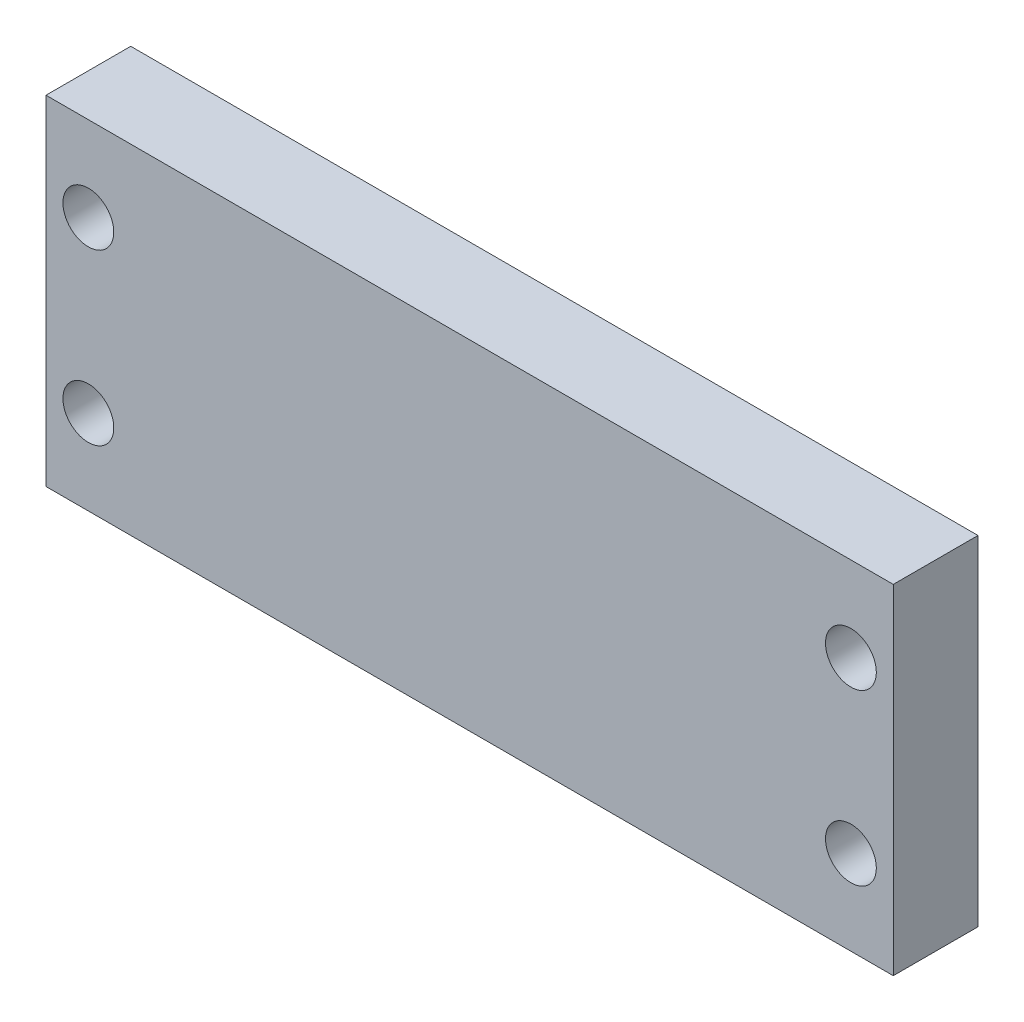
ISO-10303-21;
HEADER;
FILE_DESCRIPTION(('STEP AP214'),'2;1');
FILE_NAME('part.step','',(''),(''),'','','');
FILE_SCHEMA(('AUTOMOTIVE_DESIGN { 1 0 10303 214 1 1 1 1 }'));
ENDSEC;
DATA;
#1=APPLICATION_CONTEXT('core data for automotive mechanical design processes');
#2=APPLICATION_PROTOCOL_DEFINITION('international standard','automotive_design',2000,#1);
#3=PRODUCT_CONTEXT('',#1,'mechanical');
#4=PRODUCT('Part','Part','',(#3));
#5=PRODUCT_RELATED_PRODUCT_CATEGORY('part','',(#4));
#6=PRODUCT_DEFINITION_FORMATION('','',#4);
#7=PRODUCT_DEFINITION_CONTEXT('part definition',#1,'design');
#8=PRODUCT_DEFINITION('design','',#6,#7);
#9=PRODUCT_DEFINITION_SHAPE('','',#8);
#10=(LENGTH_UNIT() NAMED_UNIT(*) SI_UNIT(.MILLI.,.METRE.));
#11=(NAMED_UNIT(*) PLANE_ANGLE_UNIT() SI_UNIT($,.RADIAN.));
#12=(NAMED_UNIT(*) SI_UNIT($,.STERADIAN.) SOLID_ANGLE_UNIT());
#13=UNCERTAINTY_MEASURE_WITH_UNIT(LENGTH_MEASURE(1.E-05),#10,'distance_accuracy_value','');
#14=(GEOMETRIC_REPRESENTATION_CONTEXT(3) GLOBAL_UNCERTAINTY_ASSIGNED_CONTEXT((#13)) GLOBAL_UNIT_ASSIGNED_CONTEXT((#10,
#11,#12)) REPRESENTATION_CONTEXT('',''));
#15=CARTESIAN_POINT('',(0.,0.,0.));
#16=DIRECTION('',(0.,0.,1.));
#17=DIRECTION('',(1.,0.,0.));
#18=AXIS2_PLACEMENT_3D('',#15,#16,#17);
#19=CARTESIAN_POINT('',(0.,0.,5.));
#20=DIRECTION('',(0.,0.,-1.));
#21=DIRECTION('',(-1.,0.,0.));
#22=AXIS2_PLACEMENT_3D('',#19,#20,#21);
#23=PLANE('',#22);
#24=CARTESIAN_POINT('',(22.5,5.,5.));
#25=DIRECTION('',(0.,0.,1.));
#26=DIRECTION('',(1.,0.,0.));
#27=AXIS2_PLACEMENT_3D('',#24,#25,#26);
#28=CIRCLE('',#27,1.5);
#29=CARTESIAN_POINT('',(24.,5.,5.));
#30=VERTEX_POINT('',#29);
#31=EDGE_CURVE('E82',#30,#30,#28,.T.);
#32=ORIENTED_EDGE('',*,*,#31,.F.);
#33=EDGE_LOOP('',(#32));
#34=FACE_BOUND('',#33,.T.);
#35=DIRECTION('',(-1.,0.,0.));
#36=VECTOR('',#35,1.);
#37=CARTESIAN_POINT('',(0.,20.,5.));
#38=LINE('',#37,#36);
#39=CARTESIAN_POINT('',(25.,20.,5.));
#40=VERTEX_POINT('',#39);
#41=CARTESIAN_POINT('',(-25.,20.,5.));
#42=VERTEX_POINT('',#41);
#43=EDGE_CURVE('E117',#40,#42,#38,.T.);
#44=ORIENTED_EDGE('',*,*,#43,.T.);
#45=DIRECTION('',(0.,1.,0.));
#46=VECTOR('',#45,1.);
#47=CARTESIAN_POINT('',(-25.,0.,5.));
#48=LINE('',#47,#46);
#49=CARTESIAN_POINT('',(-25.,0.,5.));
#50=VERTEX_POINT('',#49);
#51=EDGE_CURVE('E89',#50,#42,#48,.T.);
#52=ORIENTED_EDGE('',*,*,#51,.F.);
#53=DIRECTION('',(1.,0.,0.));
#54=VECTOR('',#53,1.);
#55=CARTESIAN_POINT('',(0.,0.,5.));
#56=LINE('',#55,#54);
#57=CARTESIAN_POINT('',(25.,0.,5.));
#58=VERTEX_POINT('',#57);
#59=EDGE_CURVE('E66',#50,#58,#56,.T.);
#60=ORIENTED_EDGE('',*,*,#59,.T.);
#61=DIRECTION('',(0.,1.,0.));
#62=VECTOR('',#61,1.);
#63=CARTESIAN_POINT('',(25.,0.,5.));
#64=LINE('',#63,#62);
#65=EDGE_CURVE('E50',#58,#40,#64,.T.);
#66=ORIENTED_EDGE('',*,*,#65,.T.);
#67=EDGE_LOOP('',(#44,#52,#60,#66));
#68=FACE_BOUND('',#67,.T.);
#69=CARTESIAN_POINT('',(22.5,15.,5.));
#70=DIRECTION('',(0.,0.,1.));
#71=DIRECTION('',(1.,0.,0.));
#72=AXIS2_PLACEMENT_3D('',#69,#70,#71);
#73=CIRCLE('',#72,1.5);
#74=CARTESIAN_POINT('',(24.,15.,5.));
#75=VERTEX_POINT('',#74);
#76=EDGE_CURVE('E104',#75,#75,#73,.T.);
#77=ORIENTED_EDGE('',*,*,#76,.F.);
#78=EDGE_LOOP('',(#77));
#79=FACE_BOUND('',#78,.T.);
#80=CARTESIAN_POINT('',(-22.5,15.,5.));
#81=DIRECTION('',(0.,0.,-1.));
#82=DIRECTION('',(-1.,0.,0.));
#83=AXIS2_PLACEMENT_3D('',#80,#81,#82);
#84=CIRCLE('',#83,1.5);
#85=CARTESIAN_POINT('',(-24.,15.,5.));
#86=VERTEX_POINT('',#85);
#87=EDGE_CURVE('E164',#86,#86,#84,.T.);
#88=ORIENTED_EDGE('',*,*,#87,.T.);
#89=EDGE_LOOP('',(#88));
#90=FACE_BOUND('',#89,.T.);
#91=CARTESIAN_POINT('',(-22.5,5.,5.));
#92=DIRECTION('',(0.,0.,-1.));
#93=DIRECTION('',(-1.,0.,0.));
#94=AXIS2_PLACEMENT_3D('',#91,#92,#93);
#95=CIRCLE('',#94,1.5);
#96=CARTESIAN_POINT('',(-24.,5.,5.));
#97=VERTEX_POINT('',#96);
#98=EDGE_CURVE('E94',#97,#97,#95,.T.);
#99=ORIENTED_EDGE('',*,*,#98,.T.);
#100=EDGE_LOOP('',(#99));
#101=FACE_BOUND('',#100,.T.);
#102=ADVANCED_FACE('F33',(#34,#68,#79,#90,#101),#23,.F.);
#103=CARTESIAN_POINT('',(0.,0.,0.));
#104=DIRECTION('',(0.,0.,-1.));
#105=DIRECTION('',(-1.,0.,0.));
#106=AXIS2_PLACEMENT_3D('',#103,#104,#105);
#107=PLANE('',#106);
#108=CARTESIAN_POINT('',(22.5,5.,0.));
#109=DIRECTION('',(0.,0.,1.));
#110=DIRECTION('',(1.,0.,0.));
#111=AXIS2_PLACEMENT_3D('',#108,#109,#110);
#112=CIRCLE('',#111,1.5);
#113=CARTESIAN_POINT('',(24.,5.,0.));
#114=VERTEX_POINT('',#113);
#115=EDGE_CURVE('E107',#114,#114,#112,.T.);
#116=ORIENTED_EDGE('',*,*,#115,.T.);
#117=EDGE_LOOP('',(#116));
#118=FACE_BOUND('',#117,.T.);
#119=DIRECTION('',(1.,0.,0.));
#120=VECTOR('',#119,1.);
#121=CARTESIAN_POINT('',(0.,0.,0.));
#122=LINE('',#121,#120);
#123=CARTESIAN_POINT('',(-25.,0.,0.));
#124=VERTEX_POINT('',#123);
#125=CARTESIAN_POINT('',(25.,0.,0.));
#126=VERTEX_POINT('',#125);
#127=EDGE_CURVE('E61',#124,#126,#122,.T.);
#128=ORIENTED_EDGE('',*,*,#127,.F.);
#129=DIRECTION('',(0.,1.,0.));
#130=VECTOR('',#129,1.);
#131=CARTESIAN_POINT('',(-25.,0.,0.));
#132=LINE('',#131,#130);
#133=CARTESIAN_POINT('',(-25.,20.,0.));
#134=VERTEX_POINT('',#133);
#135=EDGE_CURVE('E80',#124,#134,#132,.T.);
#136=ORIENTED_EDGE('',*,*,#135,.T.);
#137=DIRECTION('',(-1.,0.,0.));
#138=VECTOR('',#137,1.);
#139=CARTESIAN_POINT('',(0.,20.,0.));
#140=LINE('',#139,#138);
#141=CARTESIAN_POINT('',(25.,20.,0.));
#142=VERTEX_POINT('',#141);
#143=EDGE_CURVE('E115',#142,#134,#140,.T.);
#144=ORIENTED_EDGE('',*,*,#143,.F.);
#145=DIRECTION('',(0.,1.,0.));
#146=VECTOR('',#145,1.);
#147=CARTESIAN_POINT('',(25.,0.,0.));
#148=LINE('',#147,#146);
#149=EDGE_CURVE('E81',#126,#142,#148,.T.);
#150=ORIENTED_EDGE('',*,*,#149,.F.);
#151=EDGE_LOOP('',(#128,#136,#144,#150));
#152=FACE_BOUND('',#151,.T.);
#153=CARTESIAN_POINT('',(22.5,15.,0.));
#154=DIRECTION('',(0.,0.,1.));
#155=DIRECTION('',(1.,0.,0.));
#156=AXIS2_PLACEMENT_3D('',#153,#154,#155);
#157=CIRCLE('',#156,1.5);
#158=CARTESIAN_POINT('',(24.,15.,0.));
#159=VERTEX_POINT('',#158);
#160=EDGE_CURVE('E103',#159,#159,#157,.T.);
#161=ORIENTED_EDGE('',*,*,#160,.T.);
#162=EDGE_LOOP('',(#161));
#163=FACE_BOUND('',#162,.T.);
#164=CARTESIAN_POINT('',(-22.5,15.,0.));
#165=DIRECTION('',(0.,0.,-1.));
#166=DIRECTION('',(-1.,0.,0.));
#167=AXIS2_PLACEMENT_3D('',#164,#165,#166);
#168=CIRCLE('',#167,1.5);
#169=CARTESIAN_POINT('',(-24.,15.,0.));
#170=VERTEX_POINT('',#169);
#171=EDGE_CURVE('E167',#170,#170,#168,.T.);
#172=ORIENTED_EDGE('',*,*,#171,.F.);
#173=EDGE_LOOP('',(#172));
#174=FACE_BOUND('',#173,.T.);
#175=CARTESIAN_POINT('',(-22.5,5.,0.));
#176=DIRECTION('',(0.,0.,-1.));
#177=DIRECTION('',(-1.,0.,0.));
#178=AXIS2_PLACEMENT_3D('',#175,#176,#177);
#179=CIRCLE('',#178,1.5);
#180=CARTESIAN_POINT('',(-24.,5.,0.));
#181=VERTEX_POINT('',#180);
#182=EDGE_CURVE('E98',#181,#181,#179,.T.);
#183=ORIENTED_EDGE('',*,*,#182,.F.);
#184=EDGE_LOOP('',(#183));
#185=FACE_BOUND('',#184,.T.);
#186=ADVANCED_FACE('F76',(#118,#152,#163,#174,#185),#107,.T.);
#187=CARTESIAN_POINT('',(0.,0.,5.));
#188=DIRECTION('',(0.,1.,0.));
#189=DIRECTION('',(0.,0.,1.));
#190=AXIS2_PLACEMENT_3D('',#187,#188,#189);
#191=PLANE('',#190);
#192=ORIENTED_EDGE('',*,*,#127,.T.);
#193=DIRECTION('',(0.,0.,-1.));
#194=VECTOR('',#193,1.);
#195=CARTESIAN_POINT('',(25.,0.,5.));
#196=LINE('',#195,#194);
#197=EDGE_CURVE('E11',#58,#126,#196,.T.);
#198=ORIENTED_EDGE('',*,*,#197,.F.);
#199=ORIENTED_EDGE('',*,*,#59,.F.);
#200=DIRECTION('',(0.,0.,-1.));
#201=VECTOR('',#200,1.);
#202=CARTESIAN_POINT('',(-25.,0.,5.));
#203=LINE('',#202,#201);
#204=EDGE_CURVE('E84',#50,#124,#203,.T.);
#205=ORIENTED_EDGE('',*,*,#204,.T.);
#206=EDGE_LOOP('',(#192,#198,#199,#205));
#207=FACE_BOUND('',#206,.T.);
#208=ADVANCED_FACE('F35',(#207),#191,.F.);
#209=CARTESIAN_POINT('',(25.,0.,5.));
#210=DIRECTION('',(-1.,0.,0.));
#211=DIRECTION('',(0.,0.,1.));
#212=AXIS2_PLACEMENT_3D('',#209,#210,#211);
#213=PLANE('',#212);
#214=ORIENTED_EDGE('',*,*,#149,.T.);
#215=DIRECTION('',(0.,0.,-1.));
#216=VECTOR('',#215,1.);
#217=CARTESIAN_POINT('',(25.,20.,5.));
#218=LINE('',#217,#216);
#219=EDGE_CURVE('E42',#40,#142,#218,.T.);
#220=ORIENTED_EDGE('',*,*,#219,.F.);
#221=ORIENTED_EDGE('',*,*,#65,.F.);
#222=ORIENTED_EDGE('',*,*,#197,.T.);
#223=EDGE_LOOP('',(#214,#220,#221,#222));
#224=FACE_BOUND('',#223,.T.);
#225=ADVANCED_FACE('F125',(#224),#213,.F.);
#226=CARTESIAN_POINT('',(0.,20.,5.));
#227=DIRECTION('',(0.,-1.,0.));
#228=DIRECTION('',(0.,0.,-1.));
#229=AXIS2_PLACEMENT_3D('',#226,#227,#228);
#230=PLANE('',#229);
#231=ORIENTED_EDGE('',*,*,#143,.T.);
#232=DIRECTION('',(0.,0.,-1.));
#233=VECTOR('',#232,1.);
#234=CARTESIAN_POINT('',(-25.,20.,5.));
#235=LINE('',#234,#233);
#236=EDGE_CURVE('E88',#42,#134,#235,.T.);
#237=ORIENTED_EDGE('',*,*,#236,.F.);
#238=ORIENTED_EDGE('',*,*,#43,.F.);
#239=ORIENTED_EDGE('',*,*,#219,.T.);
#240=EDGE_LOOP('',(#231,#237,#238,#239));
#241=FACE_BOUND('',#240,.T.);
#242=ADVANCED_FACE('F123',(#241),#230,.F.);
#243=CARTESIAN_POINT('',(22.5,5.,5.));
#244=DIRECTION('',(0.,0.,-1.));
#245=DIRECTION('',(-1.,0.,0.));
#246=AXIS2_PLACEMENT_3D('',#243,#244,#245);
#247=CYLINDRICAL_SURFACE('',#246,1.5);
#248=ORIENTED_EDGE('',*,*,#31,.T.);
#249=EDGE_LOOP('',(#248));
#250=FACE_BOUND('',#249,.T.);
#251=ORIENTED_EDGE('',*,*,#115,.F.);
#252=EDGE_LOOP('',(#251));
#253=FACE_BOUND('',#252,.T.);
#254=ADVANCED_FACE('F131',(#250,#253),#247,.F.);
#255=CARTESIAN_POINT('',(22.5,15.,5.));
#256=DIRECTION('',(0.,0.,-1.));
#257=DIRECTION('',(-1.,0.,0.));
#258=AXIS2_PLACEMENT_3D('',#255,#256,#257);
#259=CYLINDRICAL_SURFACE('',#258,1.5);
#260=ORIENTED_EDGE('',*,*,#76,.T.);
#261=EDGE_LOOP('',(#260));
#262=FACE_BOUND('',#261,.T.);
#263=ORIENTED_EDGE('',*,*,#160,.F.);
#264=EDGE_LOOP('',(#263));
#265=FACE_BOUND('',#264,.T.);
#266=ADVANCED_FACE('F145',(#262,#265),#259,.F.);
#267=CARTESIAN_POINT('',(-25.,0.,5.));
#268=DIRECTION('',(-1.,0.,0.));
#269=DIRECTION('',(0.,0.,1.));
#270=AXIS2_PLACEMENT_3D('',#267,#268,#269);
#271=PLANE('',#270);
#272=ORIENTED_EDGE('',*,*,#135,.F.);
#273=ORIENTED_EDGE('',*,*,#204,.F.);
#274=ORIENTED_EDGE('',*,*,#51,.T.);
#275=ORIENTED_EDGE('',*,*,#236,.T.);
#276=EDGE_LOOP('',(#272,#273,#274,#275));
#277=FACE_BOUND('',#276,.T.);
#278=ADVANCED_FACE('F92',(#277),#271,.T.);
#279=CARTESIAN_POINT('',(-22.5,5.,5.));
#280=DIRECTION('',(0.,0.,-1.));
#281=DIRECTION('',(-1.,0.,0.));
#282=AXIS2_PLACEMENT_3D('',#279,#280,#281);
#283=CYLINDRICAL_SURFACE('',#282,1.5);
#284=ORIENTED_EDGE('',*,*,#98,.F.);
#285=EDGE_LOOP('',(#284));
#286=FACE_BOUND('',#285,.T.);
#287=ORIENTED_EDGE('',*,*,#182,.T.);
#288=EDGE_LOOP('',(#287));
#289=FACE_BOUND('',#288,.T.);
#290=ADVANCED_FACE('F152',(#286,#289),#283,.F.);
#291=CARTESIAN_POINT('',(-22.5,15.,5.));
#292=DIRECTION('',(0.,0.,-1.));
#293=DIRECTION('',(-1.,0.,0.));
#294=AXIS2_PLACEMENT_3D('',#291,#292,#293);
#295=CYLINDRICAL_SURFACE('',#294,1.5);
#296=ORIENTED_EDGE('',*,*,#87,.F.);
#297=EDGE_LOOP('',(#296));
#298=FACE_BOUND('',#297,.T.);
#299=ORIENTED_EDGE('',*,*,#171,.T.);
#300=EDGE_LOOP('',(#299));
#301=FACE_BOUND('',#300,.T.);
#302=ADVANCED_FACE('F155',(#298,#301),#295,.F.);
#303=CLOSED_SHELL('',(#102,#186,#208,#225,#242,#254,#266,#278,#290,#302));
#304=MANIFOLD_SOLID_BREP('B2',#303);
#305=ADVANCED_BREP_SHAPE_REPRESENTATION('',(#18,#304),#14);
#306=SHAPE_DEFINITION_REPRESENTATION(#9,#305);
ENDSEC;
END-ISO-10303-21;
